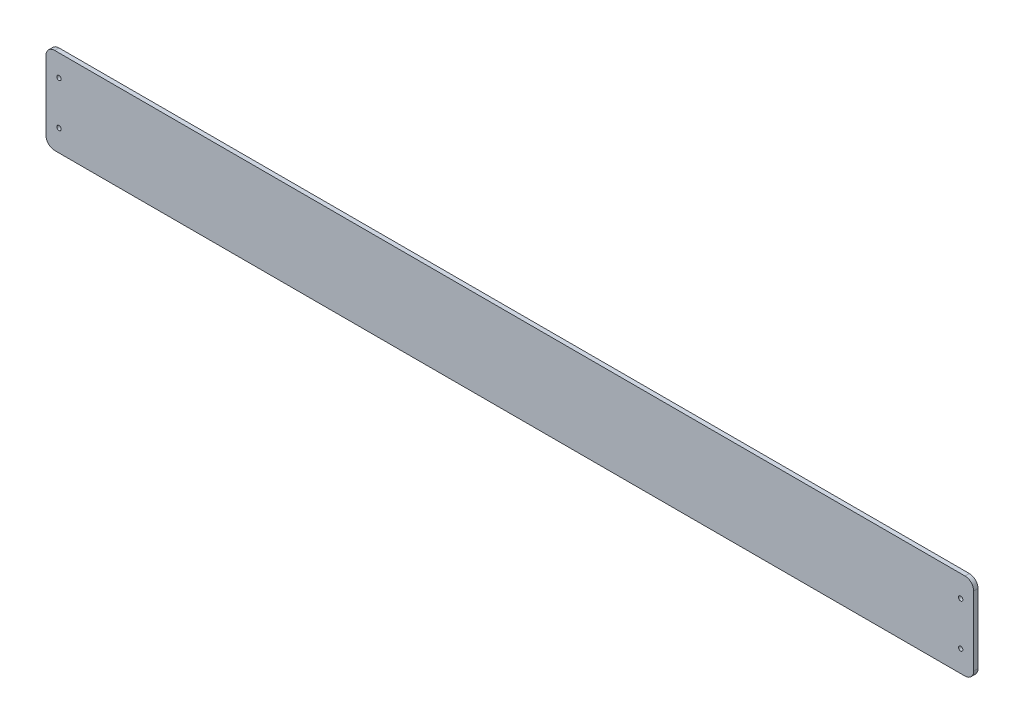
ISO-10303-21;
HEADER;
FILE_DESCRIPTION(('STEP AP214'),'2;1');
FILE_NAME('part.step','',(''),(''),'','','');
FILE_SCHEMA(('AUTOMOTIVE_DESIGN { 1 0 10303 214 1 1 1 1 }'));
ENDSEC;
DATA;
#1=APPLICATION_CONTEXT('core data for automotive mechanical design processes');
#2=APPLICATION_PROTOCOL_DEFINITION('international standard','automotive_design',2000,#1);
#3=PRODUCT_CONTEXT('',#1,'mechanical');
#4=PRODUCT('Part','Part','',(#3));
#5=PRODUCT_RELATED_PRODUCT_CATEGORY('part','',(#4));
#6=PRODUCT_DEFINITION_FORMATION('','',#4);
#7=PRODUCT_DEFINITION_CONTEXT('part definition',#1,'design');
#8=PRODUCT_DEFINITION('design','',#6,#7);
#9=PRODUCT_DEFINITION_SHAPE('','',#8);
#10=(LENGTH_UNIT() NAMED_UNIT(*) SI_UNIT(.MILLI.,.METRE.));
#11=(NAMED_UNIT(*) PLANE_ANGLE_UNIT() SI_UNIT($,.RADIAN.));
#12=(NAMED_UNIT(*) SI_UNIT($,.STERADIAN.) SOLID_ANGLE_UNIT());
#13=UNCERTAINTY_MEASURE_WITH_UNIT(LENGTH_MEASURE(1.E-05),#10,'distance_accuracy_value','');
#14=(GEOMETRIC_REPRESENTATION_CONTEXT(3) GLOBAL_UNCERTAINTY_ASSIGNED_CONTEXT((#13)) GLOBAL_UNIT_ASSIGNED_CONTEXT((#10,
#11,#12)) REPRESENTATION_CONTEXT('',''));
#15=CARTESIAN_POINT('',(0.,0.,0.));
#16=DIRECTION('',(0.,0.,1.));
#17=DIRECTION('',(1.,0.,0.));
#18=AXIS2_PLACEMENT_3D('',#15,#16,#17);
#19=CARTESIAN_POINT('',(-535.,-50.,5.));
#20=DIRECTION('',(1.,0.,0.));
#21=DIRECTION('',(0.,0.,-1.));
#22=AXIS2_PLACEMENT_3D('',#19,#20,#21);
#23=PLANE('',#22);
#24=DIRECTION('',(0.,-1.,0.));
#25=VECTOR('',#24,1.);
#26=CARTESIAN_POINT('',(-535.,-50.,0.));
#27=LINE('',#26,#25);
#28=CARTESIAN_POINT('',(-535.,40.,0.));
#29=VERTEX_POINT('',#28);
#30=CARTESIAN_POINT('',(-535.,-40.,0.));
#31=VERTEX_POINT('',#30);
#32=EDGE_CURVE('E132',#29,#31,#27,.T.);
#33=ORIENTED_EDGE('',*,*,#32,.T.);
#34=DIRECTION('',(0.,0.,-1.));
#35=VECTOR('',#34,1.);
#36=CARTESIAN_POINT('',(-535.,-40.,5.));
#37=LINE('',#36,#35);
#38=CARTESIAN_POINT('',(-535.,-40.,5.));
#39=VERTEX_POINT('',#38);
#40=EDGE_CURVE('E11',#31,#39,#37,.F.);
#41=ORIENTED_EDGE('',*,*,#40,.T.);
#42=DIRECTION('',(0.,-1.,0.));
#43=VECTOR('',#42,1.);
#44=CARTESIAN_POINT('',(-535.,-50.,5.));
#45=LINE('',#44,#43);
#46=CARTESIAN_POINT('',(-535.,40.,5.));
#47=VERTEX_POINT('',#46);
#48=EDGE_CURVE('E130',#47,#39,#45,.T.);
#49=ORIENTED_EDGE('',*,*,#48,.F.);
#50=DIRECTION('',(0.,0.,-1.));
#51=VECTOR('',#50,1.);
#52=CARTESIAN_POINT('',(-535.,40.,5.));
#53=LINE('',#52,#51);
#54=EDGE_CURVE('E43',#47,#29,#53,.T.);
#55=ORIENTED_EDGE('',*,*,#54,.T.);
#56=EDGE_LOOP('',(#33,#41,#49,#55));
#57=FACE_BOUND('',#56,.T.);
#58=ADVANCED_FACE('F34',(#57),#23,.F.);
#59=CARTESIAN_POINT('',(535.,-49.9999999999999,5.));
#60=DIRECTION('',(0.,1.,0.));
#61=DIRECTION('',(-1.,0.,0.));
#62=AXIS2_PLACEMENT_3D('',#59,#60,#61);
#63=PLANE('',#62);
#64=DIRECTION('',(1.,0.,0.));
#65=VECTOR('',#64,1.);
#66=CARTESIAN_POINT('',(535.,-49.9999999999999,0.));
#67=LINE('',#66,#65);
#68=CARTESIAN_POINT('',(-525.,-50.,0.));
#69=VERTEX_POINT('',#68);
#70=CARTESIAN_POINT('',(525.,-49.9999999999999,0.));
#71=VERTEX_POINT('',#70);
#72=EDGE_CURVE('E128',#69,#71,#67,.T.);
#73=ORIENTED_EDGE('',*,*,#72,.T.);
#74=DIRECTION('',(0.,0.,-1.));
#75=VECTOR('',#74,1.);
#76=CARTESIAN_POINT('',(525.,-49.9999999999999,5.));
#77=LINE('',#76,#75);
#78=CARTESIAN_POINT('',(525.,-49.9999999999999,5.));
#79=VERTEX_POINT('',#78);
#80=EDGE_CURVE('E107',#71,#79,#77,.F.);
#81=ORIENTED_EDGE('',*,*,#80,.T.);
#82=DIRECTION('',(1.,0.,0.));
#83=VECTOR('',#82,1.);
#84=CARTESIAN_POINT('',(535.,-49.9999999999999,5.));
#85=LINE('',#84,#83);
#86=CARTESIAN_POINT('',(-525.,-50.,5.));
#87=VERTEX_POINT('',#86);
#88=EDGE_CURVE('E184',#87,#79,#85,.T.);
#89=ORIENTED_EDGE('',*,*,#88,.F.);
#90=DIRECTION('',(0.,0.,-1.));
#91=VECTOR('',#90,1.);
#92=CARTESIAN_POINT('',(-525.,-50.,5.));
#93=LINE('',#92,#91);
#94=EDGE_CURVE('E112',#87,#69,#93,.T.);
#95=ORIENTED_EDGE('',*,*,#94,.T.);
#96=EDGE_LOOP('',(#73,#81,#89,#95));
#97=FACE_BOUND('',#96,.T.);
#98=ADVANCED_FACE('F201',(#97),#63,.F.);
#99=CARTESIAN_POINT('',(535.,-49.9999999999999,5.));
#100=DIRECTION('',(-1.,0.,0.));
#101=DIRECTION('',(0.,0.,1.));
#102=AXIS2_PLACEMENT_3D('',#99,#100,#101);
#103=PLANE('',#102);
#104=DIRECTION('',(0.,1.,0.));
#105=VECTOR('',#104,1.);
#106=CARTESIAN_POINT('',(535.,-49.9999999999999,5.));
#107=LINE('',#106,#105);
#108=CARTESIAN_POINT('',(535.,-39.9999999999999,5.));
#109=VERTEX_POINT('',#108);
#110=CARTESIAN_POINT('',(535.,40.0000000000001,5.));
#111=VERTEX_POINT('',#110);
#112=EDGE_CURVE('E121',#109,#111,#107,.T.);
#113=ORIENTED_EDGE('',*,*,#112,.F.);
#114=DIRECTION('',(0.,0.,-1.));
#115=VECTOR('',#114,1.);
#116=CARTESIAN_POINT('',(535.,-39.9999999999999,5.));
#117=LINE('',#116,#115);
#118=CARTESIAN_POINT('',(535.,-39.9999999999999,0.));
#119=VERTEX_POINT('',#118);
#120=EDGE_CURVE('E106',#109,#119,#117,.T.);
#121=ORIENTED_EDGE('',*,*,#120,.T.);
#122=DIRECTION('',(0.,1.,0.));
#123=VECTOR('',#122,1.);
#124=CARTESIAN_POINT('',(535.,-49.9999999999999,0.));
#125=LINE('',#124,#123);
#126=CARTESIAN_POINT('',(535.,40.0000000000001,0.));
#127=VERTEX_POINT('',#126);
#128=EDGE_CURVE('E119',#119,#127,#125,.T.);
#129=ORIENTED_EDGE('',*,*,#128,.T.);
#130=DIRECTION('',(0.,0.,-1.));
#131=VECTOR('',#130,1.);
#132=CARTESIAN_POINT('',(535.,40.0000000000001,5.));
#133=LINE('',#132,#131);
#134=EDGE_CURVE('E123',#127,#111,#133,.F.);
#135=ORIENTED_EDGE('',*,*,#134,.T.);
#136=EDGE_LOOP('',(#113,#121,#129,#135));
#137=FACE_BOUND('',#136,.T.);
#138=ADVANCED_FACE('F118',(#137),#103,.F.);
#139=CARTESIAN_POINT('',(535.,50.0000000000001,5.));
#140=DIRECTION('',(0.,-1.,0.));
#141=DIRECTION('',(1.,0.,0.));
#142=AXIS2_PLACEMENT_3D('',#139,#140,#141);
#143=PLANE('',#142);
#144=DIRECTION('',(-1.,0.,0.));
#145=VECTOR('',#144,1.);
#146=CARTESIAN_POINT('',(535.,50.0000000000001,5.));
#147=LINE('',#146,#145);
#148=CARTESIAN_POINT('',(525.,50.0000000000001,5.));
#149=VERTEX_POINT('',#148);
#150=CARTESIAN_POINT('',(-525.,50.,5.));
#151=VERTEX_POINT('',#150);
#152=EDGE_CURVE('E136',#149,#151,#147,.T.);
#153=ORIENTED_EDGE('',*,*,#152,.F.);
#154=DIRECTION('',(0.,0.,-1.));
#155=VECTOR('',#154,1.);
#156=CARTESIAN_POINT('',(525.,50.0000000000001,5.));
#157=LINE('',#156,#155);
#158=CARTESIAN_POINT('',(525.,50.0000000000001,0.));
#159=VERTEX_POINT('',#158);
#160=EDGE_CURVE('E153',#149,#159,#157,.T.);
#161=ORIENTED_EDGE('',*,*,#160,.T.);
#162=DIRECTION('',(-1.,0.,0.));
#163=VECTOR('',#162,1.);
#164=CARTESIAN_POINT('',(535.,50.0000000000001,0.));
#165=LINE('',#164,#163);
#166=CARTESIAN_POINT('',(-525.,50.,0.));
#167=VERTEX_POINT('',#166);
#168=EDGE_CURVE('E127',#159,#167,#165,.T.);
#169=ORIENTED_EDGE('',*,*,#168,.T.);
#170=DIRECTION('',(0.,0.,-1.));
#171=VECTOR('',#170,1.);
#172=CARTESIAN_POINT('',(-525.,50.,5.));
#173=LINE('',#172,#171);
#174=EDGE_CURVE('E51',#167,#151,#173,.F.);
#175=ORIENTED_EDGE('',*,*,#174,.T.);
#176=EDGE_LOOP('',(#153,#161,#169,#175));
#177=FACE_BOUND('',#176,.T.);
#178=ADVANCED_FACE('F208',(#177),#143,.F.);
#179=CARTESIAN_POINT('',(-535.,50.,5.));
#180=DIRECTION('',(0.,0.,1.));
#181=DIRECTION('',(1.,0.,0.));
#182=AXIS2_PLACEMENT_3D('',#179,#180,#181);
#183=PLANE('',#182);
#184=CARTESIAN_POINT('',(520.,25.0000000000001,5.));
#185=DIRECTION('',(0.,0.,1.));
#186=DIRECTION('',(-1.,0.,0.));
#187=AXIS2_PLACEMENT_3D('',#184,#185,#186);
#188=CIRCLE('',#187,2.49999999999991);
#189=CARTESIAN_POINT('',(517.5,25.0000000000001,5.));
#190=VERTEX_POINT('',#189);
#191=EDGE_CURVE('E177',#190,#190,#188,.T.);
#192=ORIENTED_EDGE('',*,*,#191,.F.);
#193=EDGE_LOOP('',(#192));
#194=FACE_BOUND('',#193,.T.);
#195=CARTESIAN_POINT('',(520.,-25.0000000000002,5.));
#196=DIRECTION('',(0.,0.,1.));
#197=DIRECTION('',(1.,0.,0.));
#198=AXIS2_PLACEMENT_3D('',#195,#196,#197);
#199=CIRCLE('',#198,2.49999999999991);
#200=CARTESIAN_POINT('',(522.5,-25.0000000000002,5.));
#201=VERTEX_POINT('',#200);
#202=EDGE_CURVE('E167',#201,#201,#199,.T.);
#203=ORIENTED_EDGE('',*,*,#202,.F.);
#204=EDGE_LOOP('',(#203));
#205=FACE_BOUND('',#204,.T.);
#206=CARTESIAN_POINT('',(-520.,-25.0000000000002,5.));
#207=DIRECTION('',(0.,0.,1.));
#208=DIRECTION('',(-1.,0.,0.));
#209=AXIS2_PLACEMENT_3D('',#206,#207,#208);
#210=CIRCLE('',#209,2.49999999999991);
#211=CARTESIAN_POINT('',(-522.5,-25.0000000000002,5.));
#212=VERTEX_POINT('',#211);
#213=EDGE_CURVE('E164',#212,#212,#210,.T.);
#214=ORIENTED_EDGE('',*,*,#213,.F.);
#215=EDGE_LOOP('',(#214));
#216=FACE_BOUND('',#215,.T.);
#217=CARTESIAN_POINT('',(-520.,25.0000000000001,5.));
#218=DIRECTION('',(0.,0.,1.));
#219=DIRECTION('',(1.,0.,0.));
#220=AXIS2_PLACEMENT_3D('',#217,#218,#219);
#221=CIRCLE('',#220,2.49999999999991);
#222=CARTESIAN_POINT('',(-517.5,25.0000000000001,5.));
#223=VERTEX_POINT('',#222);
#224=EDGE_CURVE('E161',#223,#223,#221,.T.);
#225=ORIENTED_EDGE('',*,*,#224,.F.);
#226=EDGE_LOOP('',(#225));
#227=FACE_BOUND('',#226,.T.);
#228=ORIENTED_EDGE('',*,*,#88,.T.);
#229=CARTESIAN_POINT('',(525.,-39.9999999999999,5.));
#230=DIRECTION('',(0.,0.,1.));
#231=DIRECTION('',(1.,0.,0.));
#232=AXIS2_PLACEMENT_3D('',#229,#230,#231);
#233=CIRCLE('',#232,10.);
#234=EDGE_CURVE('E150',#79,#109,#233,.T.);
#235=ORIENTED_EDGE('',*,*,#234,.T.);
#236=ORIENTED_EDGE('',*,*,#112,.T.);
#237=CARTESIAN_POINT('',(525.,40.0000000000001,5.));
#238=DIRECTION('',(0.,0.,1.));
#239=DIRECTION('',(1.,0.,0.));
#240=AXIS2_PLACEMENT_3D('',#237,#238,#239);
#241=CIRCLE('',#240,10.);
#242=EDGE_CURVE('E58',#111,#149,#241,.T.);
#243=ORIENTED_EDGE('',*,*,#242,.T.);
#244=ORIENTED_EDGE('',*,*,#152,.T.);
#245=CARTESIAN_POINT('',(-525.,40.,5.));
#246=DIRECTION('',(0.,0.,1.));
#247=DIRECTION('',(1.,0.,0.));
#248=AXIS2_PLACEMENT_3D('',#245,#246,#247);
#249=CIRCLE('',#248,10.);
#250=EDGE_CURVE('E145',#151,#47,#249,.T.);
#251=ORIENTED_EDGE('',*,*,#250,.T.);
#252=ORIENTED_EDGE('',*,*,#48,.T.);
#253=CARTESIAN_POINT('',(-525.,-40.,5.));
#254=DIRECTION('',(0.,0.,1.));
#255=DIRECTION('',(1.,0.,0.));
#256=AXIS2_PLACEMENT_3D('',#253,#254,#255);
#257=CIRCLE('',#256,10.);
#258=EDGE_CURVE('E147',#39,#87,#257,.T.);
#259=ORIENTED_EDGE('',*,*,#258,.T.);
#260=EDGE_LOOP('',(#228,#235,#236,#243,#244,#251,#252,#259));
#261=FACE_BOUND('',#260,.T.);
#262=ADVANCED_FACE('F199',(#194,#205,#216,#227,#261),#183,.T.);
#263=CARTESIAN_POINT('',(-535.,50.,0.));
#264=DIRECTION('',(0.,0.,1.));
#265=DIRECTION('',(1.,0.,0.));
#266=AXIS2_PLACEMENT_3D('',#263,#264,#265);
#267=PLANE('',#266);
#268=CARTESIAN_POINT('',(520.,25.0000000000001,0.));
#269=DIRECTION('',(0.,0.,1.));
#270=DIRECTION('',(1.,0.,0.));
#271=AXIS2_PLACEMENT_3D('',#268,#269,#270);
#272=CIRCLE('',#271,2.49999999999991);
#273=CARTESIAN_POINT('',(522.5,25.0000000000001,0.));
#274=VERTEX_POINT('',#273);
#275=EDGE_CURVE('E38',#274,#274,#272,.T.);
#276=ORIENTED_EDGE('',*,*,#275,.T.);
#277=EDGE_LOOP('',(#276));
#278=FACE_BOUND('',#277,.T.);
#279=CARTESIAN_POINT('',(520.,-25.0000000000002,0.));
#280=DIRECTION('',(0.,0.,1.));
#281=DIRECTION('',(1.,0.,0.));
#282=AXIS2_PLACEMENT_3D('',#279,#280,#281);
#283=CIRCLE('',#282,2.49999999999991);
#284=CARTESIAN_POINT('',(522.5,-25.0000000000002,0.));
#285=VERTEX_POINT('',#284);
#286=EDGE_CURVE('E165',#285,#285,#283,.T.);
#287=ORIENTED_EDGE('',*,*,#286,.T.);
#288=EDGE_LOOP('',(#287));
#289=FACE_BOUND('',#288,.T.);
#290=CARTESIAN_POINT('',(-520.,-25.0000000000002,0.));
#291=DIRECTION('',(0.,0.,1.));
#292=DIRECTION('',(1.,0.,0.));
#293=AXIS2_PLACEMENT_3D('',#290,#291,#292);
#294=CIRCLE('',#293,2.49999999999991);
#295=CARTESIAN_POINT('',(-517.5,-25.0000000000002,0.));
#296=VERTEX_POINT('',#295);
#297=EDGE_CURVE('E162',#296,#296,#294,.T.);
#298=ORIENTED_EDGE('',*,*,#297,.T.);
#299=EDGE_LOOP('',(#298));
#300=FACE_BOUND('',#299,.T.);
#301=CARTESIAN_POINT('',(-520.,25.0000000000001,0.));
#302=DIRECTION('',(0.,0.,1.));
#303=DIRECTION('',(1.,0.,0.));
#304=AXIS2_PLACEMENT_3D('',#301,#302,#303);
#305=CIRCLE('',#304,2.49999999999991);
#306=CARTESIAN_POINT('',(-517.5,25.0000000000001,0.));
#307=VERTEX_POINT('',#306);
#308=EDGE_CURVE('E158',#307,#307,#305,.T.);
#309=ORIENTED_EDGE('',*,*,#308,.T.);
#310=EDGE_LOOP('',(#309));
#311=FACE_BOUND('',#310,.T.);
#312=ORIENTED_EDGE('',*,*,#128,.F.);
#313=CARTESIAN_POINT('',(525.,-39.9999999999999,0.));
#314=DIRECTION('',(0.,0.,1.));
#315=DIRECTION('',(1.,0.,0.));
#316=AXIS2_PLACEMENT_3D('',#313,#314,#315);
#317=CIRCLE('',#316,10.);
#318=EDGE_CURVE('E102',#119,#71,#317,.F.);
#319=ORIENTED_EDGE('',*,*,#318,.T.);
#320=ORIENTED_EDGE('',*,*,#72,.F.);
#321=CARTESIAN_POINT('',(-525.,-40.,0.));
#322=DIRECTION('',(0.,0.,1.));
#323=DIRECTION('',(1.,0.,0.));
#324=AXIS2_PLACEMENT_3D('',#321,#322,#323);
#325=CIRCLE('',#324,10.);
#326=EDGE_CURVE('E139',#69,#31,#325,.F.);
#327=ORIENTED_EDGE('',*,*,#326,.T.);
#328=ORIENTED_EDGE('',*,*,#32,.F.);
#329=CARTESIAN_POINT('',(-525.,40.,0.));
#330=DIRECTION('',(0.,0.,1.));
#331=DIRECTION('',(1.,0.,0.));
#332=AXIS2_PLACEMENT_3D('',#329,#330,#331);
#333=CIRCLE('',#332,10.);
#334=EDGE_CURVE('E122',#29,#167,#333,.F.);
#335=ORIENTED_EDGE('',*,*,#334,.T.);
#336=ORIENTED_EDGE('',*,*,#168,.F.);
#337=CARTESIAN_POINT('',(525.,40.0000000000001,0.));
#338=DIRECTION('',(0.,0.,1.));
#339=DIRECTION('',(1.,0.,0.));
#340=AXIS2_PLACEMENT_3D('',#337,#338,#339);
#341=CIRCLE('',#340,10.);
#342=EDGE_CURVE('E113',#159,#127,#341,.F.);
#343=ORIENTED_EDGE('',*,*,#342,.T.);
#344=EDGE_LOOP('',(#312,#319,#320,#327,#328,#335,#336,#343));
#345=FACE_BOUND('',#344,.T.);
#346=ADVANCED_FACE('F125',(#278,#289,#300,#311,#345),#267,.F.);
#347=CARTESIAN_POINT('',(525.,-39.9999999999999,5.));
#348=DIRECTION('',(0.,0.,-1.));
#349=DIRECTION('',(-1.,0.,0.));
#350=AXIS2_PLACEMENT_3D('',#347,#348,#349);
#351=CYLINDRICAL_SURFACE('',#350,10.);
#352=ORIENTED_EDGE('',*,*,#234,.F.);
#353=ORIENTED_EDGE('',*,*,#80,.F.);
#354=ORIENTED_EDGE('',*,*,#318,.F.);
#355=ORIENTED_EDGE('',*,*,#120,.F.);
#356=EDGE_LOOP('',(#352,#353,#354,#355));
#357=FACE_BOUND('',#356,.T.);
#358=ADVANCED_FACE('F105',(#357),#351,.T.);
#359=CARTESIAN_POINT('',(525.,40.0000000000001,5.));
#360=DIRECTION('',(0.,0.,-1.));
#361=DIRECTION('',(-1.,0.,0.));
#362=AXIS2_PLACEMENT_3D('',#359,#360,#361);
#363=CYLINDRICAL_SURFACE('',#362,10.);
#364=ORIENTED_EDGE('',*,*,#242,.F.);
#365=ORIENTED_EDGE('',*,*,#134,.F.);
#366=ORIENTED_EDGE('',*,*,#342,.F.);
#367=ORIENTED_EDGE('',*,*,#160,.F.);
#368=EDGE_LOOP('',(#364,#365,#366,#367));
#369=FACE_BOUND('',#368,.T.);
#370=ADVANCED_FACE('F215',(#369),#363,.T.);
#371=CARTESIAN_POINT('',(-525.,-40.,5.));
#372=DIRECTION('',(0.,0.,-1.));
#373=DIRECTION('',(-1.,0.,0.));
#374=AXIS2_PLACEMENT_3D('',#371,#372,#373);
#375=CYLINDRICAL_SURFACE('',#374,10.);
#376=ORIENTED_EDGE('',*,*,#258,.F.);
#377=ORIENTED_EDGE('',*,*,#40,.F.);
#378=ORIENTED_EDGE('',*,*,#326,.F.);
#379=ORIENTED_EDGE('',*,*,#94,.F.);
#380=EDGE_LOOP('',(#376,#377,#378,#379));
#381=FACE_BOUND('',#380,.T.);
#382=ADVANCED_FACE('F196',(#381),#375,.T.);
#383=CARTESIAN_POINT('',(-525.,40.,5.));
#384=DIRECTION('',(0.,0.,-1.));
#385=DIRECTION('',(-1.,0.,0.));
#386=AXIS2_PLACEMENT_3D('',#383,#384,#385);
#387=CYLINDRICAL_SURFACE('',#386,10.);
#388=ORIENTED_EDGE('',*,*,#250,.F.);
#389=ORIENTED_EDGE('',*,*,#174,.F.);
#390=ORIENTED_EDGE('',*,*,#334,.F.);
#391=ORIENTED_EDGE('',*,*,#54,.F.);
#392=EDGE_LOOP('',(#388,#389,#390,#391));
#393=FACE_BOUND('',#392,.T.);
#394=ADVANCED_FACE('F36',(#393),#387,.T.);
#395=CARTESIAN_POINT('',(-520.,25.0000000000001,-5.));
#396=DIRECTION('',(0.,0.,1.));
#397=DIRECTION('',(1.,0.,0.));
#398=AXIS2_PLACEMENT_3D('',#395,#396,#397);
#399=CYLINDRICAL_SURFACE('',#398,2.49999999999991);
#400=ORIENTED_EDGE('',*,*,#224,.T.);
#401=EDGE_LOOP('',(#400));
#402=FACE_BOUND('',#401,.T.);
#403=ORIENTED_EDGE('',*,*,#308,.F.);
#404=EDGE_LOOP('',(#403));
#405=FACE_BOUND('',#404,.T.);
#406=ADVANCED_FACE('F222',(#402,#405),#399,.F.);
#407=CARTESIAN_POINT('',(-520.,-25.0000000000002,-5.));
#408=DIRECTION('',(0.,0.,1.));
#409=DIRECTION('',(1.,0.,0.));
#410=AXIS2_PLACEMENT_3D('',#407,#408,#409);
#411=CYLINDRICAL_SURFACE('',#410,2.49999999999991);
#412=ORIENTED_EDGE('',*,*,#213,.T.);
#413=EDGE_LOOP('',(#412));
#414=FACE_BOUND('',#413,.T.);
#415=ORIENTED_EDGE('',*,*,#297,.F.);
#416=EDGE_LOOP('',(#415));
#417=FACE_BOUND('',#416,.T.);
#418=ADVANCED_FACE('F227',(#414,#417),#411,.F.);
#419=CARTESIAN_POINT('',(520.,-25.0000000000002,-5.));
#420=DIRECTION('',(0.,0.,1.));
#421=DIRECTION('',(1.,0.,0.));
#422=AXIS2_PLACEMENT_3D('',#419,#420,#421);
#423=CYLINDRICAL_SURFACE('',#422,2.49999999999991);
#424=ORIENTED_EDGE('',*,*,#202,.T.);
#425=EDGE_LOOP('',(#424));
#426=FACE_BOUND('',#425,.T.);
#427=ORIENTED_EDGE('',*,*,#286,.F.);
#428=EDGE_LOOP('',(#427));
#429=FACE_BOUND('',#428,.T.);
#430=ADVANCED_FACE('F245',(#426,#429),#423,.F.);
#431=CARTESIAN_POINT('',(520.,25.0000000000001,-5.));
#432=DIRECTION('',(0.,0.,1.));
#433=DIRECTION('',(1.,0.,0.));
#434=AXIS2_PLACEMENT_3D('',#431,#432,#433);
#435=CYLINDRICAL_SURFACE('',#434,2.49999999999991);
#436=ORIENTED_EDGE('',*,*,#191,.T.);
#437=EDGE_LOOP('',(#436));
#438=FACE_BOUND('',#437,.T.);
#439=ORIENTED_EDGE('',*,*,#275,.F.);
#440=EDGE_LOOP('',(#439));
#441=FACE_BOUND('',#440,.T.);
#442=ADVANCED_FACE('F249',(#438,#441),#435,.F.);
#443=CLOSED_SHELL('',(#58,#98,#138,#178,#262,#346,#358,#370,#382,#394,#406,#418,#430,#442));
#444=MANIFOLD_SOLID_BREP('B2',#443);
#445=ADVANCED_BREP_SHAPE_REPRESENTATION('',(#18,#444),#14);
#446=SHAPE_DEFINITION_REPRESENTATION(#9,#445);
ENDSEC;
END-ISO-10303-21;
